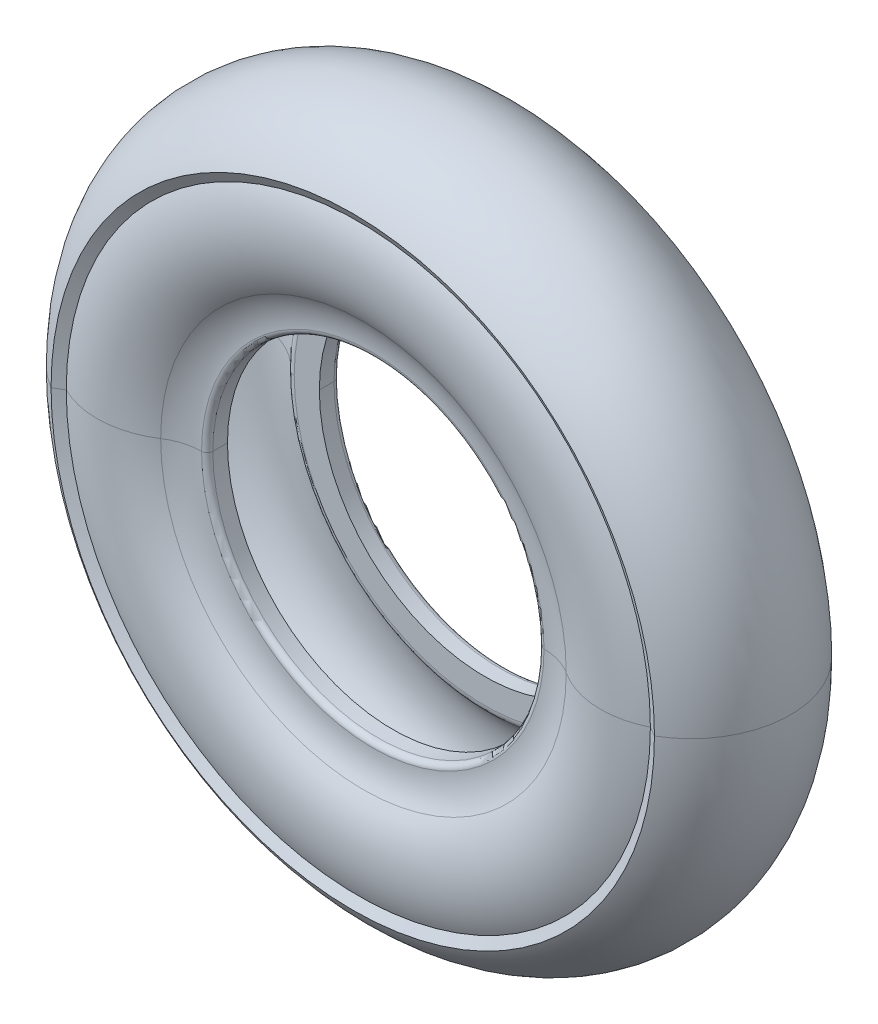
ISO-10303-21;
HEADER;
FILE_DESCRIPTION(('STEP AP214'),'2;1');
FILE_NAME('part.step','',(''),(''),'','','');
FILE_SCHEMA(('AUTOMOTIVE_DESIGN { 1 0 10303 214 1 1 1 1 }'));
ENDSEC;
DATA;
#1=APPLICATION_CONTEXT('core data for automotive mechanical design processes');
#2=APPLICATION_PROTOCOL_DEFINITION('international standard','automotive_design',2000,#1);
#3=PRODUCT_CONTEXT('',#1,'mechanical');
#4=PRODUCT('Part','Part','',(#3));
#5=PRODUCT_RELATED_PRODUCT_CATEGORY('part','',(#4));
#6=PRODUCT_DEFINITION_FORMATION('','',#4);
#7=PRODUCT_DEFINITION_CONTEXT('part definition',#1,'design');
#8=PRODUCT_DEFINITION('design','',#6,#7);
#9=PRODUCT_DEFINITION_SHAPE('','',#8);
#10=(LENGTH_UNIT() NAMED_UNIT(*) SI_UNIT(.MILLI.,.METRE.));
#11=(NAMED_UNIT(*) PLANE_ANGLE_UNIT() SI_UNIT($,.RADIAN.));
#12=(NAMED_UNIT(*) SI_UNIT($,.STERADIAN.) SOLID_ANGLE_UNIT());
#13=UNCERTAINTY_MEASURE_WITH_UNIT(LENGTH_MEASURE(1.E-05),#10,'distance_accuracy_value','');
#14=(GEOMETRIC_REPRESENTATION_CONTEXT(3) GLOBAL_UNCERTAINTY_ASSIGNED_CONTEXT((#13)) GLOBAL_UNIT_ASSIGNED_CONTEXT((#10,
#11,#12)) REPRESENTATION_CONTEXT('',''));
#15=CARTESIAN_POINT('',(0.,0.,0.));
#16=DIRECTION('',(0.,0.,1.));
#17=DIRECTION('',(1.,0.,0.));
#18=AXIS2_PLACEMENT_3D('',#15,#16,#17);
#19=CARTESIAN_POINT('',(0.,0.,24.3067350080178));
#20=DIRECTION('',(0.,0.,1.));
#21=DIRECTION('',(1.,0.,0.));
#22=AXIS2_PLACEMENT_3D('',#19,#20,#21);
#23=CONICAL_SURFACE('',#22,85.0265,1.04719755119661);
#24=DIRECTION('',(-0.866025403784445,0.,0.499999999999989));
#25=VECTOR('',#24,1.);
#26=CARTESIAN_POINT('',(-85.0265,0.,24.3067350080178));
#27=LINE('',#26,#25);
#28=CARTESIAN_POINT('',(-82.3110709239277,0.,22.7389812999823));
#29=VERTEX_POINT('',#28);
#30=CARTESIAN_POINT('',(-85.0265,0.,24.3067350080178));
#31=VERTEX_POINT('',#30);
#32=EDGE_CURVE('E172',#29,#31,#27,.T.);
#33=ORIENTED_EDGE('',*,*,#32,.F.);
#34=CARTESIAN_POINT('',(0.,0.,22.7389812999823));
#35=DIRECTION('',(0.,0.,-1.));
#36=DIRECTION('',(-1.,0.,0.));
#37=AXIS2_PLACEMENT_3D('',#34,#35,#36);
#38=CIRCLE('',#37,82.3110709239277);
#39=CARTESIAN_POINT('',(82.3110709239277,0.,22.7389812999823));
#40=VERTEX_POINT('',#39);
#41=EDGE_CURVE('E144',#29,#40,#38,.T.);
#42=ORIENTED_EDGE('',*,*,#41,.T.);
#43=DIRECTION('',(0.866025403784445,0.,0.499999999999989));
#44=VECTOR('',#43,1.);
#45=CARTESIAN_POINT('',(85.0265,0.,24.3067350080178));
#46=LINE('',#45,#44);
#47=CARTESIAN_POINT('',(85.0265,0.,24.3067350080178));
#48=VERTEX_POINT('',#47);
#49=EDGE_CURVE('E181',#40,#48,#46,.T.);
#50=ORIENTED_EDGE('',*,*,#49,.T.);
#51=CARTESIAN_POINT('',(0.,0.,24.3067350080178));
#52=DIRECTION('',(0.,0.,-1.));
#53=DIRECTION('',(-1.,0.,0.));
#54=AXIS2_PLACEMENT_3D('',#51,#52,#53);
#55=CIRCLE('',#54,85.0265);
#56=EDGE_CURVE('E174',#31,#48,#55,.T.);
#57=ORIENTED_EDGE('',*,*,#56,.F.);
#58=EDGE_LOOP('',(#33,#42,#50,#57));
#59=FACE_BOUND('',#58,.T.);
#60=ADVANCED_FACE('F17',(#59),#23,.F.);
#61=CARTESIAN_POINT('',(0.,0.,0.));
#62=DIRECTION('',(0.,0.,-1.));
#63=DIRECTION('',(-1.,0.,0.));
#64=AXIS2_PLACEMENT_3D('',#61,#62,#63);
#65=TOROIDAL_SURFACE('',#64,70.993,25.4);
#66=CARTESIAN_POINT('',(70.993,0.,0.));
#67=DIRECTION('',(0.,1.,0.));
#68=DIRECTION('',(-1.,0.,0.));
#69=AXIS2_PLACEMENT_3D('',#66,#67,#68);
#70=CIRCLE('',#69,25.4);
#71=CARTESIAN_POINT('',(57.15,0.,21.2962755194424));
#72=VERTEX_POINT('',#71);
#73=EDGE_CURVE('E166',#72,#40,#70,.T.);
#74=ORIENTED_EDGE('',*,*,#73,.F.);
#75=CARTESIAN_POINT('',(0.,0.,21.2962755194424));
#76=DIRECTION('',(0.,0.,-1.));
#77=DIRECTION('',(-1.,0.,0.));
#78=AXIS2_PLACEMENT_3D('',#75,#76,#77);
#79=CIRCLE('',#78,57.15);
#80=CARTESIAN_POINT('',(-57.15,0.,21.2962755194424));
#81=VERTEX_POINT('',#80);
#82=EDGE_CURVE('E159',#72,#81,#79,.T.);
#83=ORIENTED_EDGE('',*,*,#82,.T.);
#84=CARTESIAN_POINT('',(-70.993,0.,0.));
#85=DIRECTION('',(0.,-1.,0.));
#86=DIRECTION('',(0.,0.,-1.));
#87=AXIS2_PLACEMENT_3D('',#84,#85,#86);
#88=CIRCLE('',#87,25.4);
#89=EDGE_CURVE('E153',#81,#29,#88,.T.);
#90=ORIENTED_EDGE('',*,*,#89,.T.);
#91=CARTESIAN_POINT('',(0.,0.,22.7389812999823));
#92=DIRECTION('',(0.,0.,-1.));
#93=DIRECTION('',(-1.,0.,0.));
#94=AXIS2_PLACEMENT_3D('',#91,#92,#93);
#95=CIRCLE('',#94,82.3110709239277);
#96=EDGE_CURVE('E157',#40,#29,#95,.T.);
#97=ORIENTED_EDGE('',*,*,#96,.F.);
#98=EDGE_LOOP('',(#74,#83,#90,#97));
#99=FACE_BOUND('',#98,.T.);
#100=ADVANCED_FACE('F155',(#99),#65,.T.);
#101=CARTESIAN_POINT('',(0.,0.,34.9727827337632));
#102=DIRECTION('',(0.,0.,-1.));
#103=DIRECTION('',(-1.,0.,0.));
#104=AXIS2_PLACEMENT_3D('',#101,#102,#103);
#105=TOROIDAL_SURFACE('',#104,48.26,16.3119266055046);
#106=CARTESIAN_POINT('',(48.26,0.,34.9727827337632));
#107=DIRECTION('',(0.,1.,0.));
#108=DIRECTION('',(-1.,0.,0.));
#109=AXIS2_PLACEMENT_3D('',#106,#107,#108);
#110=CIRCLE('',#109,16.3119266055046);
#111=CARTESIAN_POINT('',(48.26,0.,18.6608561282586));
#112=VERTEX_POINT('',#111);
#113=EDGE_CURVE('E21',#72,#112,#110,.T.);
#114=ORIENTED_EDGE('',*,*,#113,.F.);
#115=CARTESIAN_POINT('',(0.,0.,21.2962755194424));
#116=DIRECTION('',(0.,0.,-1.));
#117=DIRECTION('',(-1.,0.,0.));
#118=AXIS2_PLACEMENT_3D('',#115,#116,#117);
#119=CIRCLE('',#118,57.15);
#120=EDGE_CURVE('E205',#81,#72,#119,.T.);
#121=ORIENTED_EDGE('',*,*,#120,.F.);
#122=CARTESIAN_POINT('',(-48.26,0.,34.9727827337632));
#123=DIRECTION('',(0.,-1.,0.));
#124=DIRECTION('',(0.,0.,-1.));
#125=AXIS2_PLACEMENT_3D('',#122,#123,#124);
#126=CIRCLE('',#125,16.3119266055046);
#127=CARTESIAN_POINT('',(-48.26,0.,18.6608561282586));
#128=VERTEX_POINT('',#127);
#129=EDGE_CURVE('E267',#81,#128,#126,.T.);
#130=ORIENTED_EDGE('',*,*,#129,.T.);
#131=CARTESIAN_POINT('',(0.,0.,18.6608561282586));
#132=DIRECTION('',(0.,0.,-1.));
#133=DIRECTION('',(-1.,0.,0.));
#134=AXIS2_PLACEMENT_3D('',#131,#132,#133);
#135=CIRCLE('',#134,48.26);
#136=EDGE_CURVE('E210',#128,#112,#135,.T.);
#137=ORIENTED_EDGE('',*,*,#136,.T.);
#138=EDGE_LOOP('',(#114,#121,#130,#137));
#139=FACE_BOUND('',#138,.T.);
#140=ADVANCED_FACE('F438',(#139),#105,.F.);
#141=CARTESIAN_POINT('',(0.,0.,17.0733561282586));
#142=DIRECTION('',(0.,0.,-1.));
#143=DIRECTION('',(-1.,0.,0.));
#144=AXIS2_PLACEMENT_3D('',#141,#142,#143);
#145=TOROIDAL_SURFACE('',#144,48.26,1.5875);
#146=CARTESIAN_POINT('',(48.26,0.,17.0733561282586));
#147=DIRECTION('',(0.,1.,0.));
#148=DIRECTION('',(-1.,0.,0.));
#149=AXIS2_PLACEMENT_3D('',#146,#147,#148);
#150=CIRCLE('',#149,1.5875);
#151=CARTESIAN_POINT('',(46.6725,0.,17.0733561282586));
#152=VERTEX_POINT('',#151);
#153=EDGE_CURVE('E266',#152,#112,#150,.T.);
#154=ORIENTED_EDGE('',*,*,#153,.F.);
#155=CARTESIAN_POINT('',(0.,0.,17.0733561282586));
#156=DIRECTION('',(0.,0.,-1.));
#157=DIRECTION('',(-1.,0.,0.));
#158=AXIS2_PLACEMENT_3D('',#155,#156,#157);
#159=CIRCLE('',#158,46.6725);
#160=CARTESIAN_POINT('',(-46.6725,0.,17.0733561282586));
#161=VERTEX_POINT('',#160);
#162=EDGE_CURVE('E209',#152,#161,#159,.T.);
#163=ORIENTED_EDGE('',*,*,#162,.T.);
#164=CARTESIAN_POINT('',(-48.26,0.,17.0733561282586));
#165=DIRECTION('',(0.,-1.,0.));
#166=DIRECTION('',(0.,0.,-1.));
#167=AXIS2_PLACEMENT_3D('',#164,#165,#166);
#168=CIRCLE('',#167,1.5875);
#169=EDGE_CURVE('E206',#161,#128,#168,.T.);
#170=ORIENTED_EDGE('',*,*,#169,.T.);
#171=CARTESIAN_POINT('',(0.,0.,18.6608561282586));
#172=DIRECTION('',(0.,0.,-1.));
#173=DIRECTION('',(-1.,0.,0.));
#174=AXIS2_PLACEMENT_3D('',#171,#172,#173);
#175=CIRCLE('',#174,48.26);
#176=EDGE_CURVE('E278',#112,#128,#175,.T.);
#177=ORIENTED_EDGE('',*,*,#176,.F.);
#178=EDGE_LOOP('',(#154,#163,#170,#177));
#179=FACE_BOUND('',#178,.T.);
#180=ADVANCED_FACE('F451',(#179),#145,.T.);
#181=CARTESIAN_POINT('',(0.,0.,0.));
#182=DIRECTION('',(0.,0.,-1.));
#183=DIRECTION('',(-1.,0.,0.));
#184=AXIS2_PLACEMENT_3D('',#181,#182,#183);
#185=CYLINDRICAL_SURFACE('',#184,46.6725);
#186=DIRECTION('',(0.,0.,-1.));
#187=VECTOR('',#186,1.);
#188=CARTESIAN_POINT('',(46.6725,0.,0.));
#189=LINE('',#188,#187);
#190=CARTESIAN_POINT('',(46.6725,0.,12.9458561282585));
#191=VERTEX_POINT('',#190);
#192=EDGE_CURVE('E189',#152,#191,#189,.T.);
#193=ORIENTED_EDGE('',*,*,#192,.F.);
#194=CARTESIAN_POINT('',(0.,0.,17.0733561282586));
#195=DIRECTION('',(0.,0.,-1.));
#196=DIRECTION('',(-1.,0.,0.));
#197=AXIS2_PLACEMENT_3D('',#194,#195,#196);
#198=CIRCLE('',#197,46.6725);
#199=EDGE_CURVE('E262',#161,#152,#198,.T.);
#200=ORIENTED_EDGE('',*,*,#199,.F.);
#201=DIRECTION('',(0.,0.,-1.));
#202=VECTOR('',#201,1.);
#203=CARTESIAN_POINT('',(-46.6725,0.,0.));
#204=LINE('',#203,#202);
#205=CARTESIAN_POINT('',(-46.6725,0.,12.9458561282585));
#206=VERTEX_POINT('',#205);
#207=EDGE_CURVE('E227',#161,#206,#204,.T.);
#208=ORIENTED_EDGE('',*,*,#207,.T.);
#209=CARTESIAN_POINT('',(0.,0.,12.9458561282585));
#210=DIRECTION('',(0.,0.,-1.));
#211=DIRECTION('',(-1.,0.,0.));
#212=AXIS2_PLACEMENT_3D('',#209,#210,#211);
#213=CIRCLE('',#212,46.6725);
#214=EDGE_CURVE('E11',#206,#191,#213,.T.);
#215=ORIENTED_EDGE('',*,*,#214,.T.);
#216=EDGE_LOOP('',(#193,#200,#208,#215));
#217=FACE_BOUND('',#216,.T.);
#218=ADVANCED_FACE('F454',(#217),#185,.F.);
#219=CARTESIAN_POINT('',(0.,53.7481524731334,12.9458561282585));
#220=DIRECTION('',(0.,0.,-1.));
#221=DIRECTION('',(0.,-1.,0.));
#222=AXIS2_PLACEMENT_3D('',#219,#220,#221);
#223=PLANE('',#222);
#224=ORIENTED_EDGE('',*,*,#214,.F.);
#225=CARTESIAN_POINT('',(0.,0.,12.9458561282585));
#226=DIRECTION('',(0.,0.,-1.));
#227=DIRECTION('',(-1.,0.,0.));
#228=AXIS2_PLACEMENT_3D('',#225,#226,#227);
#229=CIRCLE('',#228,46.6725);
#230=EDGE_CURVE('E223',#191,#206,#229,.T.);
#231=ORIENTED_EDGE('',*,*,#230,.F.);
#232=EDGE_LOOP('',(#224,#231));
#233=FACE_BOUND('',#232,.T.);
#234=CARTESIAN_POINT('',(0.,0.,12.9458561282585));
#235=DIRECTION('',(0.,0.,-1.));
#236=DIRECTION('',(-1.,0.,0.));
#237=AXIS2_PLACEMENT_3D('',#234,#235,#236);
#238=CIRCLE('',#237,53.7481524731334);
#239=CARTESIAN_POINT('',(-53.7481524731334,0.,12.9458561282585));
#240=VERTEX_POINT('',#239);
#241=CARTESIAN_POINT('',(53.7481524731334,0.,12.9458561282585));
#242=VERTEX_POINT('',#241);
#243=EDGE_CURVE('E317',#240,#242,#238,.T.);
#244=ORIENTED_EDGE('',*,*,#243,.T.);
#245=CARTESIAN_POINT('',(0.,0.,12.9458561282585));
#246=DIRECTION('',(0.,0.,-1.));
#247=DIRECTION('',(-1.,0.,0.));
#248=AXIS2_PLACEMENT_3D('',#245,#246,#247);
#249=CIRCLE('',#248,53.7481524731334);
#250=EDGE_CURVE('E28',#242,#240,#249,.T.);
#251=ORIENTED_EDGE('',*,*,#250,.T.);
#252=EDGE_LOOP('',(#244,#251));
#253=FACE_BOUND('',#252,.T.);
#254=ADVANCED_FACE('F459',(#233,#253),#223,.T.);
#255=CARTESIAN_POINT('',(0.,0.,15.4858561282586));
#256=DIRECTION('',(0.,0.,-1.));
#257=DIRECTION('',(-1.,0.,0.));
#258=AXIS2_PLACEMENT_3D('',#255,#256,#257);
#259=TOROIDAL_SURFACE('',#258,53.7481524731334,2.54);
#260=CARTESIAN_POINT('',(53.7481524731334,0.,15.4858561282586));
#261=DIRECTION('',(0.,1.,0.));
#262=DIRECTION('',(-1.,0.,0.));
#263=AXIS2_PLACEMENT_3D('',#260,#261,#262);
#264=CIRCLE('',#263,2.54);
#265=CARTESIAN_POINT('',(55.6379987774475,0.,13.7887760046138));
#266=VERTEX_POINT('',#265);
#267=EDGE_CURVE('E321',#266,#242,#264,.T.);
#268=ORIENTED_EDGE('',*,*,#267,.F.);
#269=CARTESIAN_POINT('',(0.,0.,13.7887760046138));
#270=DIRECTION('',(0.,0.,-1.));
#271=DIRECTION('',(-1.,0.,0.));
#272=AXIS2_PLACEMENT_3D('',#269,#270,#271);
#273=CIRCLE('',#272,55.6379987774475);
#274=CARTESIAN_POINT('',(-55.6379987774475,0.,13.7887760046138));
#275=VERTEX_POINT('',#274);
#276=EDGE_CURVE('E261',#266,#275,#273,.T.);
#277=ORIENTED_EDGE('',*,*,#276,.T.);
#278=CARTESIAN_POINT('',(-53.7481524731334,0.,15.4858561282586));
#279=DIRECTION('',(0.,-1.,0.));
#280=DIRECTION('',(0.,0.,-1.));
#281=AXIS2_PLACEMENT_3D('',#278,#279,#280);
#282=CIRCLE('',#281,2.54);
#283=EDGE_CURVE('E314',#275,#240,#282,.T.);
#284=ORIENTED_EDGE('',*,*,#283,.T.);
#285=ORIENTED_EDGE('',*,*,#250,.F.);
#286=EDGE_LOOP('',(#268,#277,#284,#285));
#287=FACE_BOUND('',#286,.T.);
#288=ADVANCED_FACE('F456',(#287),#259,.T.);
#289=CARTESIAN_POINT('',(0.,0.,0.));
#290=DIRECTION('',(0.,0.,-1.));
#291=DIRECTION('',(-1.,0.,0.));
#292=AXIS2_PLACEMENT_3D('',#289,#290,#291);
#293=TOROIDAL_SURFACE('',#292,70.993,20.6375);
#294=CARTESIAN_POINT('',(70.993,0.,0.));
#295=DIRECTION('',(0.,1.,0.));
#296=DIRECTION('',(-1.,0.,0.));
#297=AXIS2_PLACEMENT_3D('',#294,#295,#296);
#298=CIRCLE('',#297,20.6375);
#299=CARTESIAN_POINT('',(55.6379987774475,0.,-13.7887760046138));
#300=VERTEX_POINT('',#299);
#301=EDGE_CURVE('E256',#266,#300,#298,.T.);
#302=ORIENTED_EDGE('',*,*,#301,.F.);
#303=CARTESIAN_POINT('',(0.,0.,13.7887760046138));
#304=DIRECTION('',(0.,0.,-1.));
#305=DIRECTION('',(-1.,0.,0.));
#306=AXIS2_PLACEMENT_3D('',#303,#304,#305);
#307=CIRCLE('',#306,55.6379987774475);
#308=EDGE_CURVE('E277',#275,#266,#307,.T.);
#309=ORIENTED_EDGE('',*,*,#308,.F.);
#310=CARTESIAN_POINT('',(-70.993,0.,0.));
#311=DIRECTION('',(0.,-1.,0.));
#312=DIRECTION('',(0.,0.,-1.));
#313=AXIS2_PLACEMENT_3D('',#310,#311,#312);
#314=CIRCLE('',#313,20.6375);
#315=CARTESIAN_POINT('',(-55.6379987774475,0.,-13.7887760046138));
#316=VERTEX_POINT('',#315);
#317=EDGE_CURVE('E284',#275,#316,#314,.T.);
#318=ORIENTED_EDGE('',*,*,#317,.T.);
#319=CARTESIAN_POINT('',(0.,0.,-13.7887760046138));
#320=DIRECTION('',(0.,0.,-1.));
#321=DIRECTION('',(-1.,0.,0.));
#322=AXIS2_PLACEMENT_3D('',#319,#320,#321);
#323=CIRCLE('',#322,55.6379987774475);
#324=EDGE_CURVE('E215',#316,#300,#323,.T.);
#325=ORIENTED_EDGE('',*,*,#324,.T.);
#326=EDGE_LOOP('',(#302,#309,#318,#325));
#327=FACE_BOUND('',#326,.T.);
#328=ADVANCED_FACE('F429',(#327),#293,.F.);
#329=CARTESIAN_POINT('',(0.,0.,-15.4858561282586));
#330=DIRECTION('',(0.,0.,-1.));
#331=DIRECTION('',(-1.,0.,0.));
#332=AXIS2_PLACEMENT_3D('',#329,#330,#331);
#333=TOROIDAL_SURFACE('',#332,53.7481524731334,2.54);
#334=CARTESIAN_POINT('',(53.7481524731334,0.,-15.4858561282586));
#335=DIRECTION('',(0.,1.,0.));
#336=DIRECTION('',(-1.,0.,0.));
#337=AXIS2_PLACEMENT_3D('',#334,#335,#336);
#338=CIRCLE('',#337,2.54);
#339=CARTESIAN_POINT('',(53.7481524731334,0.,-12.9458561282585));
#340=VERTEX_POINT('',#339);
#341=EDGE_CURVE('E211',#340,#300,#338,.T.);
#342=ORIENTED_EDGE('',*,*,#341,.F.);
#343=CARTESIAN_POINT('',(0.,0.,-12.9458561282585));
#344=DIRECTION('',(0.,0.,-1.));
#345=DIRECTION('',(-1.,0.,0.));
#346=AXIS2_PLACEMENT_3D('',#343,#344,#345);
#347=CIRCLE('',#346,53.7481524731334);
#348=CARTESIAN_POINT('',(-53.7481524731334,0.,-12.9458561282585));
#349=VERTEX_POINT('',#348);
#350=EDGE_CURVE('E238',#340,#349,#347,.T.);
#351=ORIENTED_EDGE('',*,*,#350,.T.);
#352=CARTESIAN_POINT('',(-53.7481524731334,0.,-15.4858561282586));
#353=DIRECTION('',(0.,-1.,0.));
#354=DIRECTION('',(0.,0.,-1.));
#355=AXIS2_PLACEMENT_3D('',#352,#353,#354);
#356=CIRCLE('',#355,2.54);
#357=EDGE_CURVE('E301',#349,#316,#356,.T.);
#358=ORIENTED_EDGE('',*,*,#357,.T.);
#359=CARTESIAN_POINT('',(0.,0.,-13.7887760046138));
#360=DIRECTION('',(0.,0.,-1.));
#361=DIRECTION('',(-1.,0.,0.));
#362=AXIS2_PLACEMENT_3D('',#359,#360,#361);
#363=CIRCLE('',#362,55.6379987774475);
#364=EDGE_CURVE('E260',#300,#316,#363,.T.);
#365=ORIENTED_EDGE('',*,*,#364,.F.);
#366=EDGE_LOOP('',(#342,#351,#358,#365));
#367=FACE_BOUND('',#366,.T.);
#368=ADVANCED_FACE('F409',(#367),#333,.T.);
#369=CARTESIAN_POINT('',(0.,46.6725,-12.9458561282585));
#370=DIRECTION('',(0.,0.,1.));
#371=DIRECTION('',(1.,0.,0.));
#372=AXIS2_PLACEMENT_3D('',#369,#370,#371);
#373=PLANE('',#372);
#374=CARTESIAN_POINT('',(0.,0.,-12.9458561282585));
#375=DIRECTION('',(0.,0.,-1.));
#376=DIRECTION('',(-1.,0.,0.));
#377=AXIS2_PLACEMENT_3D('',#374,#375,#376);
#378=CIRCLE('',#377,46.6725);
#379=CARTESIAN_POINT('',(-46.6725,0.,-12.9458561282585));
#380=VERTEX_POINT('',#379);
#381=CARTESIAN_POINT('',(46.6725,0.,-12.9458561282585));
#382=VERTEX_POINT('',#381);
#383=EDGE_CURVE('E201',#380,#382,#378,.T.);
#384=ORIENTED_EDGE('',*,*,#383,.T.);
#385=CARTESIAN_POINT('',(0.,0.,-12.9458561282585));
#386=DIRECTION('',(0.,0.,-1.));
#387=DIRECTION('',(-1.,0.,0.));
#388=AXIS2_PLACEMENT_3D('',#385,#386,#387);
#389=CIRCLE('',#388,46.6725);
#390=EDGE_CURVE('E304',#382,#380,#389,.T.);
#391=ORIENTED_EDGE('',*,*,#390,.T.);
#392=EDGE_LOOP('',(#384,#391));
#393=FACE_BOUND('',#392,.T.);
#394=CARTESIAN_POINT('',(0.,0.,-12.9458561282585));
#395=DIRECTION('',(0.,0.,-1.));
#396=DIRECTION('',(-1.,0.,0.));
#397=AXIS2_PLACEMENT_3D('',#394,#395,#396);
#398=CIRCLE('',#397,53.7481524731334);
#399=EDGE_CURVE('E216',#349,#340,#398,.T.);
#400=ORIENTED_EDGE('',*,*,#399,.F.);
#401=ORIENTED_EDGE('',*,*,#350,.F.);
#402=EDGE_LOOP('',(#400,#401));
#403=FACE_BOUND('',#402,.T.);
#404=ADVANCED_FACE('F416',(#393,#403),#373,.T.);
#405=CARTESIAN_POINT('',(0.,0.,0.));
#406=DIRECTION('',(0.,0.,-1.));
#407=DIRECTION('',(-1.,0.,0.));
#408=AXIS2_PLACEMENT_3D('',#405,#406,#407);
#409=CYLINDRICAL_SURFACE('',#408,46.6725);
#410=DIRECTION('',(0.,0.,-1.));
#411=VECTOR('',#410,1.);
#412=CARTESIAN_POINT('',(46.6725,0.,0.));
#413=LINE('',#412,#411);
#414=CARTESIAN_POINT('',(46.6725,0.,-17.0733561282586));
#415=VERTEX_POINT('',#414);
#416=EDGE_CURVE('E308',#382,#415,#413,.T.);
#417=ORIENTED_EDGE('',*,*,#416,.F.);
#418=ORIENTED_EDGE('',*,*,#383,.F.);
#419=DIRECTION('',(0.,0.,-1.));
#420=VECTOR('',#419,1.);
#421=CARTESIAN_POINT('',(-46.6725,0.,0.));
#422=LINE('',#421,#420);
#423=CARTESIAN_POINT('',(-46.6725,0.,-17.0733561282586));
#424=VERTEX_POINT('',#423);
#425=EDGE_CURVE('E268',#380,#424,#422,.T.);
#426=ORIENTED_EDGE('',*,*,#425,.T.);
#427=CARTESIAN_POINT('',(0.,0.,-17.0733561282586));
#428=DIRECTION('',(0.,0.,-1.));
#429=DIRECTION('',(-1.,0.,0.));
#430=AXIS2_PLACEMENT_3D('',#427,#428,#429);
#431=CIRCLE('',#430,46.6725);
#432=EDGE_CURVE('E242',#424,#415,#431,.T.);
#433=ORIENTED_EDGE('',*,*,#432,.T.);
#434=EDGE_LOOP('',(#417,#418,#426,#433));
#435=FACE_BOUND('',#434,.T.);
#436=ADVANCED_FACE('F418',(#435),#409,.F.);
#437=CARTESIAN_POINT('',(0.,0.,-17.0733561282586));
#438=DIRECTION('',(0.,0.,-1.));
#439=DIRECTION('',(-1.,0.,0.));
#440=AXIS2_PLACEMENT_3D('',#437,#438,#439);
#441=TOROIDAL_SURFACE('',#440,48.26,1.5875);
#442=CARTESIAN_POINT('',(48.26,0.,-17.0733561282586));
#443=DIRECTION('',(0.,1.,0.));
#444=DIRECTION('',(-1.,0.,0.));
#445=AXIS2_PLACEMENT_3D('',#442,#443,#444);
#446=CIRCLE('',#445,1.5875);
#447=CARTESIAN_POINT('',(48.26,0.,-18.6608561282586));
#448=VERTEX_POINT('',#447);
#449=EDGE_CURVE('E246',#448,#415,#446,.T.);
#450=ORIENTED_EDGE('',*,*,#449,.F.);
#451=CARTESIAN_POINT('',(0.,0.,-18.6608561282586));
#452=DIRECTION('',(0.,0.,-1.));
#453=DIRECTION('',(-1.,0.,0.));
#454=AXIS2_PLACEMENT_3D('',#451,#452,#453);
#455=CIRCLE('',#454,48.26);
#456=CARTESIAN_POINT('',(-48.26,0.,-18.6608561282586));
#457=VERTEX_POINT('',#456);
#458=EDGE_CURVE('E217',#448,#457,#455,.T.);
#459=ORIENTED_EDGE('',*,*,#458,.T.);
#460=CARTESIAN_POINT('',(-48.26,0.,-17.0733561282586));
#461=DIRECTION('',(0.,-1.,0.));
#462=DIRECTION('',(0.,0.,-1.));
#463=AXIS2_PLACEMENT_3D('',#460,#461,#462);
#464=CIRCLE('',#463,1.5875);
#465=EDGE_CURVE('E222',#457,#424,#464,.T.);
#466=ORIENTED_EDGE('',*,*,#465,.T.);
#467=CARTESIAN_POINT('',(0.,0.,-17.0733561282586));
#468=DIRECTION('',(0.,0.,-1.));
#469=DIRECTION('',(-1.,0.,0.));
#470=AXIS2_PLACEMENT_3D('',#467,#468,#469);
#471=CIRCLE('',#470,46.6725);
#472=EDGE_CURVE('E273',#415,#424,#471,.T.);
#473=ORIENTED_EDGE('',*,*,#472,.F.);
#474=EDGE_LOOP('',(#450,#459,#466,#473));
#475=FACE_BOUND('',#474,.T.);
#476=ADVANCED_FACE('F426',(#475),#441,.T.);
#477=CARTESIAN_POINT('',(0.,0.,-34.9727827337632));
#478=DIRECTION('',(0.,0.,-1.));
#479=DIRECTION('',(-1.,0.,0.));
#480=AXIS2_PLACEMENT_3D('',#477,#478,#479);
#481=TOROIDAL_SURFACE('',#480,48.26,16.3119266055046);
#482=CARTESIAN_POINT('',(48.26,0.,-34.9727827337632));
#483=DIRECTION('',(0.,1.,0.));
#484=DIRECTION('',(-1.,0.,0.));
#485=AXIS2_PLACEMENT_3D('',#482,#483,#484);
#486=CIRCLE('',#485,16.3119266055046);
#487=CARTESIAN_POINT('',(57.15,0.,-21.2962755194424));
#488=VERTEX_POINT('',#487);
#489=EDGE_CURVE('E221',#448,#488,#486,.T.);
#490=ORIENTED_EDGE('',*,*,#489,.F.);
#491=CARTESIAN_POINT('',(0.,0.,-18.6608561282586));
#492=DIRECTION('',(0.,0.,-1.));
#493=DIRECTION('',(-1.,0.,0.));
#494=AXIS2_PLACEMENT_3D('',#491,#492,#493);
#495=CIRCLE('',#494,48.26);
#496=EDGE_CURVE('E272',#457,#448,#495,.T.);
#497=ORIENTED_EDGE('',*,*,#496,.F.);
#498=CARTESIAN_POINT('',(-48.26,0.,-34.9727827337632));
#499=DIRECTION('',(0.,-1.,0.));
#500=DIRECTION('',(0.,0.,-1.));
#501=AXIS2_PLACEMENT_3D('',#498,#499,#500);
#502=CIRCLE('',#501,16.3119266055046);
#503=CARTESIAN_POINT('',(-57.15,0.,-21.2962755194424));
#504=VERTEX_POINT('',#503);
#505=EDGE_CURVE('E251',#457,#504,#502,.T.);
#506=ORIENTED_EDGE('',*,*,#505,.T.);
#507=CARTESIAN_POINT('',(0.,0.,-21.2962755194424));
#508=DIRECTION('',(0.,0.,-1.));
#509=DIRECTION('',(-1.,0.,0.));
#510=AXIS2_PLACEMENT_3D('',#507,#508,#509);
#511=CIRCLE('',#510,57.15);
#512=EDGE_CURVE('E193',#504,#488,#511,.T.);
#513=ORIENTED_EDGE('',*,*,#512,.T.);
#514=EDGE_LOOP('',(#490,#497,#506,#513));
#515=FACE_BOUND('',#514,.T.);
#516=ADVANCED_FACE('F386',(#515),#481,.F.);
#517=CARTESIAN_POINT('',(0.,0.,0.));
#518=DIRECTION('',(0.,0.,-1.));
#519=DIRECTION('',(-1.,0.,0.));
#520=AXIS2_PLACEMENT_3D('',#517,#518,#519);
#521=TOROIDAL_SURFACE('',#520,70.993,25.4);
#522=CARTESIAN_POINT('',(70.993,0.,0.));
#523=DIRECTION('',(0.,1.,0.));
#524=DIRECTION('',(-1.,0.,0.));
#525=AXIS2_PLACEMENT_3D('',#522,#523,#524);
#526=CIRCLE('',#525,25.4);
#527=CARTESIAN_POINT('',(82.3110709239277,0.,-22.7389812999823));
#528=VERTEX_POINT('',#527);
#529=EDGE_CURVE('E198',#528,#488,#526,.T.);
#530=ORIENTED_EDGE('',*,*,#529,.F.);
#531=CARTESIAN_POINT('',(0.,0.,-22.7389812999823));
#532=DIRECTION('',(0.,0.,-1.));
#533=DIRECTION('',(-1.,0.,0.));
#534=AXIS2_PLACEMENT_3D('',#531,#532,#533);
#535=CIRCLE('',#534,82.3110709239277);
#536=CARTESIAN_POINT('',(-82.3110709239277,0.,-22.7389812999823));
#537=VERTEX_POINT('',#536);
#538=EDGE_CURVE('E228',#528,#537,#535,.T.);
#539=ORIENTED_EDGE('',*,*,#538,.T.);
#540=CARTESIAN_POINT('',(-70.993,0.,0.));
#541=DIRECTION('',(0.,-1.,0.));
#542=DIRECTION('',(0.,0.,-1.));
#543=AXIS2_PLACEMENT_3D('',#540,#541,#542);
#544=CIRCLE('',#543,25.4);
#545=EDGE_CURVE('E197',#537,#504,#544,.T.);
#546=ORIENTED_EDGE('',*,*,#545,.T.);
#547=CARTESIAN_POINT('',(0.,0.,-21.2962755194424));
#548=DIRECTION('',(0.,0.,-1.));
#549=DIRECTION('',(-1.,0.,0.));
#550=AXIS2_PLACEMENT_3D('',#547,#548,#549);
#551=CIRCLE('',#550,57.15);
#552=EDGE_CURVE('E297',#488,#504,#551,.T.);
#553=ORIENTED_EDGE('',*,*,#552,.F.);
#554=EDGE_LOOP('',(#530,#539,#546,#553));
#555=FACE_BOUND('',#554,.T.);
#556=ADVANCED_FACE('F374',(#555),#521,.T.);
#557=CARTESIAN_POINT('',(0.,0.,-22.7389812999823));
#558=DIRECTION('',(0.,0.,-1.));
#559=DIRECTION('',(-1.,0.,0.));
#560=AXIS2_PLACEMENT_3D('',#557,#558,#559);
#561=CONICAL_SURFACE('',#560,82.3110709239277,1.04719755119661);
#562=DIRECTION('',(0.866025403784444,0.,-0.499999999999991));
#563=VECTOR('',#562,1.);
#564=CARTESIAN_POINT('',(82.3110709239277,0.,-22.7389812999823));
#565=LINE('',#564,#563);
#566=CARTESIAN_POINT('',(85.0265,0.,-24.3067350080178));
#567=VERTEX_POINT('',#566);
#568=EDGE_CURVE('E232',#528,#567,#565,.T.);
#569=ORIENTED_EDGE('',*,*,#568,.F.);
#570=CARTESIAN_POINT('',(0.,0.,-22.7389812999823));
#571=DIRECTION('',(0.,0.,-1.));
#572=DIRECTION('',(-1.,0.,0.));
#573=AXIS2_PLACEMENT_3D('',#570,#571,#572);
#574=CIRCLE('',#573,82.3110709239277);
#575=EDGE_CURVE('E247',#537,#528,#574,.T.);
#576=ORIENTED_EDGE('',*,*,#575,.F.);
#577=DIRECTION('',(-0.866025403784444,0.,-0.499999999999991));
#578=VECTOR('',#577,1.);
#579=CARTESIAN_POINT('',(-82.3110709239277,0.,-22.7389812999823));
#580=LINE('',#579,#578);
#581=CARTESIAN_POINT('',(-85.0265,0.,-24.3067350080178));
#582=VERTEX_POINT('',#581);
#583=EDGE_CURVE('E233',#537,#582,#580,.T.);
#584=ORIENTED_EDGE('',*,*,#583,.T.);
#585=CARTESIAN_POINT('',(0.,0.,-24.3067350080178));
#586=DIRECTION('',(0.,0.,-1.));
#587=DIRECTION('',(-1.,0.,0.));
#588=AXIS2_PLACEMENT_3D('',#585,#586,#587);
#589=CIRCLE('',#588,85.0265);
#590=EDGE_CURVE('E202',#582,#567,#589,.T.);
#591=ORIENTED_EDGE('',*,*,#590,.T.);
#592=EDGE_LOOP('',(#569,#576,#584,#591));
#593=FACE_BOUND('',#592,.T.);
#594=ADVANCED_FACE('F371',(#593),#561,.F.);
#595=CARTESIAN_POINT('',(0.,0.,0.));
#596=DIRECTION('',(0.,0.,-1.));
#597=DIRECTION('',(-1.,0.,0.));
#598=AXIS2_PLACEMENT_3D('',#595,#596,#597);
#599=TOROIDAL_SURFACE('',#598,70.993,28.067);
#600=CARTESIAN_POINT('',(70.993,0.,0.));
#601=DIRECTION('',(0.,1.,0.));
#602=DIRECTION('',(-1.,0.,0.));
#603=AXIS2_PLACEMENT_3D('',#600,#601,#602);
#604=CIRCLE('',#603,28.067);
#605=EDGE_CURVE('E252',#48,#567,#604,.T.);
#606=ORIENTED_EDGE('',*,*,#605,.F.);
#607=CARTESIAN_POINT('',(0.,0.,24.3067350080178));
#608=DIRECTION('',(0.,0.,-1.));
#609=DIRECTION('',(-1.,0.,0.));
#610=AXIS2_PLACEMENT_3D('',#607,#608,#609);
#611=CIRCLE('',#610,85.0265);
#612=EDGE_CURVE('E178',#48,#31,#611,.T.);
#613=ORIENTED_EDGE('',*,*,#612,.T.);
#614=CARTESIAN_POINT('',(-70.993,0.,0.));
#615=DIRECTION('',(0.,-1.,0.));
#616=DIRECTION('',(0.,0.,-1.));
#617=AXIS2_PLACEMENT_3D('',#614,#615,#616);
#618=CIRCLE('',#617,28.067);
#619=EDGE_CURVE('E43',#31,#582,#618,.T.);
#620=ORIENTED_EDGE('',*,*,#619,.T.);
#621=CARTESIAN_POINT('',(0.,0.,-24.3067350080178));
#622=DIRECTION('',(0.,0.,-1.));
#623=DIRECTION('',(-1.,0.,0.));
#624=AXIS2_PLACEMENT_3D('',#621,#622,#623);
#625=CIRCLE('',#624,85.0265);
#626=EDGE_CURVE('E237',#567,#582,#625,.T.);
#627=ORIENTED_EDGE('',*,*,#626,.F.);
#628=EDGE_LOOP('',(#606,#613,#620,#627));
#629=FACE_BOUND('',#628,.T.);
#630=ADVANCED_FACE('F19',(#629),#599,.T.);
#631=CARTESIAN_POINT('',(0.,0.,0.));
#632=DIRECTION('',(0.,0.,-1.));
#633=DIRECTION('',(-1.,0.,0.));
#634=AXIS2_PLACEMENT_3D('',#631,#632,#633);
#635=TOROIDAL_SURFACE('',#634,70.993,28.067);
#636=ORIENTED_EDGE('',*,*,#56,.T.);
#637=ORIENTED_EDGE('',*,*,#605,.T.);
#638=ORIENTED_EDGE('',*,*,#590,.F.);
#639=ORIENTED_EDGE('',*,*,#619,.F.);
#640=EDGE_LOOP('',(#636,#637,#638,#639));
#641=FACE_BOUND('',#640,.T.);
#642=ADVANCED_FACE('F360',(#641),#635,.T.);
#643=CARTESIAN_POINT('',(0.,0.,-22.7389812999823));
#644=DIRECTION('',(0.,0.,-1.));
#645=DIRECTION('',(-1.,0.,0.));
#646=AXIS2_PLACEMENT_3D('',#643,#644,#645);
#647=CONICAL_SURFACE('',#646,82.3110709239277,1.04719755119661);
#648=ORIENTED_EDGE('',*,*,#538,.F.);
#649=ORIENTED_EDGE('',*,*,#568,.T.);
#650=ORIENTED_EDGE('',*,*,#626,.T.);
#651=ORIENTED_EDGE('',*,*,#583,.F.);
#652=EDGE_LOOP('',(#648,#649,#650,#651));
#653=FACE_BOUND('',#652,.T.);
#654=ADVANCED_FACE('F367',(#653),#647,.F.);
#655=CARTESIAN_POINT('',(0.,0.,0.));
#656=DIRECTION('',(0.,0.,-1.));
#657=DIRECTION('',(-1.,0.,0.));
#658=AXIS2_PLACEMENT_3D('',#655,#656,#657);
#659=TOROIDAL_SURFACE('',#658,70.993,25.4);
#660=ORIENTED_EDGE('',*,*,#575,.T.);
#661=ORIENTED_EDGE('',*,*,#529,.T.);
#662=ORIENTED_EDGE('',*,*,#512,.F.);
#663=ORIENTED_EDGE('',*,*,#545,.F.);
#664=EDGE_LOOP('',(#660,#661,#662,#663));
#665=FACE_BOUND('',#664,.T.);
#666=ADVANCED_FACE('F379',(#665),#659,.T.);
#667=CARTESIAN_POINT('',(0.,0.,-34.9727827337632));
#668=DIRECTION('',(0.,0.,-1.));
#669=DIRECTION('',(-1.,0.,0.));
#670=AXIS2_PLACEMENT_3D('',#667,#668,#669);
#671=TOROIDAL_SURFACE('',#670,48.26,16.3119266055046);
#672=ORIENTED_EDGE('',*,*,#458,.F.);
#673=ORIENTED_EDGE('',*,*,#489,.T.);
#674=ORIENTED_EDGE('',*,*,#552,.T.);
#675=ORIENTED_EDGE('',*,*,#505,.F.);
#676=EDGE_LOOP('',(#672,#673,#674,#675));
#677=FACE_BOUND('',#676,.T.);
#678=ADVANCED_FACE('F390',(#677),#671,.F.);
#679=CARTESIAN_POINT('',(0.,0.,-17.0733561282586));
#680=DIRECTION('',(0.,0.,-1.));
#681=DIRECTION('',(-1.,0.,0.));
#682=AXIS2_PLACEMENT_3D('',#679,#680,#681);
#683=TOROIDAL_SURFACE('',#682,48.26,1.5875);
#684=ORIENTED_EDGE('',*,*,#496,.T.);
#685=ORIENTED_EDGE('',*,*,#449,.T.);
#686=ORIENTED_EDGE('',*,*,#432,.F.);
#687=ORIENTED_EDGE('',*,*,#465,.F.);
#688=EDGE_LOOP('',(#684,#685,#686,#687));
#689=FACE_BOUND('',#688,.T.);
#690=ADVANCED_FACE('F444',(#689),#683,.T.);
#691=CARTESIAN_POINT('',(0.,0.,0.));
#692=DIRECTION('',(0.,0.,-1.));
#693=DIRECTION('',(-1.,0.,0.));
#694=AXIS2_PLACEMENT_3D('',#691,#692,#693);
#695=CYLINDRICAL_SURFACE('',#694,46.6725);
#696=ORIENTED_EDGE('',*,*,#390,.F.);
#697=ORIENTED_EDGE('',*,*,#416,.T.);
#698=ORIENTED_EDGE('',*,*,#472,.T.);
#699=ORIENTED_EDGE('',*,*,#425,.F.);
#700=EDGE_LOOP('',(#696,#697,#698,#699));
#701=FACE_BOUND('',#700,.T.);
#702=ADVANCED_FACE('F465',(#701),#695,.F.);
#703=CARTESIAN_POINT('',(0.,0.,-15.4858561282586));
#704=DIRECTION('',(0.,0.,-1.));
#705=DIRECTION('',(-1.,0.,0.));
#706=AXIS2_PLACEMENT_3D('',#703,#704,#705);
#707=TOROIDAL_SURFACE('',#706,53.7481524731334,2.54);
#708=ORIENTED_EDGE('',*,*,#399,.T.);
#709=ORIENTED_EDGE('',*,*,#341,.T.);
#710=ORIENTED_EDGE('',*,*,#324,.F.);
#711=ORIENTED_EDGE('',*,*,#357,.F.);
#712=EDGE_LOOP('',(#708,#709,#710,#711));
#713=FACE_BOUND('',#712,.T.);
#714=ADVANCED_FACE('F415',(#713),#707,.T.);
#715=CARTESIAN_POINT('',(0.,0.,0.));
#716=DIRECTION('',(0.,0.,-1.));
#717=DIRECTION('',(-1.,0.,0.));
#718=AXIS2_PLACEMENT_3D('',#715,#716,#717);
#719=TOROIDAL_SURFACE('',#718,70.993,20.6375);
#720=ORIENTED_EDGE('',*,*,#276,.F.);
#721=ORIENTED_EDGE('',*,*,#301,.T.);
#722=ORIENTED_EDGE('',*,*,#364,.T.);
#723=ORIENTED_EDGE('',*,*,#317,.F.);
#724=EDGE_LOOP('',(#720,#721,#722,#723));
#725=FACE_BOUND('',#724,.T.);
#726=ADVANCED_FACE('F446',(#725),#719,.F.);
#727=CARTESIAN_POINT('',(0.,0.,15.4858561282586));
#728=DIRECTION('',(0.,0.,-1.));
#729=DIRECTION('',(-1.,0.,0.));
#730=AXIS2_PLACEMENT_3D('',#727,#728,#729);
#731=TOROIDAL_SURFACE('',#730,53.7481524731334,2.54);
#732=ORIENTED_EDGE('',*,*,#308,.T.);
#733=ORIENTED_EDGE('',*,*,#267,.T.);
#734=ORIENTED_EDGE('',*,*,#243,.F.);
#735=ORIENTED_EDGE('',*,*,#283,.F.);
#736=EDGE_LOOP('',(#732,#733,#734,#735));
#737=FACE_BOUND('',#736,.T.);
#738=ADVANCED_FACE('F449',(#737),#731,.T.);
#739=CARTESIAN_POINT('',(0.,0.,0.));
#740=DIRECTION('',(0.,0.,-1.));
#741=DIRECTION('',(-1.,0.,0.));
#742=AXIS2_PLACEMENT_3D('',#739,#740,#741);
#743=CYLINDRICAL_SURFACE('',#742,46.6725);
#744=ORIENTED_EDGE('',*,*,#162,.F.);
#745=ORIENTED_EDGE('',*,*,#192,.T.);
#746=ORIENTED_EDGE('',*,*,#230,.T.);
#747=ORIENTED_EDGE('',*,*,#207,.F.);
#748=EDGE_LOOP('',(#744,#745,#746,#747));
#749=FACE_BOUND('',#748,.T.);
#750=ADVANCED_FACE('F460',(#749),#743,.F.);
#751=CARTESIAN_POINT('',(0.,0.,17.0733561282586));
#752=DIRECTION('',(0.,0.,-1.));
#753=DIRECTION('',(-1.,0.,0.));
#754=AXIS2_PLACEMENT_3D('',#751,#752,#753);
#755=TOROIDAL_SURFACE('',#754,48.26,1.5875);
#756=ORIENTED_EDGE('',*,*,#199,.T.);
#757=ORIENTED_EDGE('',*,*,#153,.T.);
#758=ORIENTED_EDGE('',*,*,#136,.F.);
#759=ORIENTED_EDGE('',*,*,#169,.F.);
#760=EDGE_LOOP('',(#756,#757,#758,#759));
#761=FACE_BOUND('',#760,.T.);
#762=ADVANCED_FACE('F462',(#761),#755,.T.);
#763=CARTESIAN_POINT('',(0.,0.,34.9727827337632));
#764=DIRECTION('',(0.,0.,-1.));
#765=DIRECTION('',(-1.,0.,0.));
#766=AXIS2_PLACEMENT_3D('',#763,#764,#765);
#767=TOROIDAL_SURFACE('',#766,48.26,16.3119266055046);
#768=ORIENTED_EDGE('',*,*,#82,.F.);
#769=ORIENTED_EDGE('',*,*,#113,.T.);
#770=ORIENTED_EDGE('',*,*,#176,.T.);
#771=ORIENTED_EDGE('',*,*,#129,.F.);
#772=EDGE_LOOP('',(#768,#769,#770,#771));
#773=FACE_BOUND('',#772,.T.);
#774=ADVANCED_FACE('F670',(#773),#767,.F.);
#775=CARTESIAN_POINT('',(0.,0.,0.));
#776=DIRECTION('',(0.,0.,-1.));
#777=DIRECTION('',(-1.,0.,0.));
#778=AXIS2_PLACEMENT_3D('',#775,#776,#777);
#779=TOROIDAL_SURFACE('',#778,70.993,25.4);
#780=ORIENTED_EDGE('',*,*,#120,.T.);
#781=ORIENTED_EDGE('',*,*,#73,.T.);
#782=ORIENTED_EDGE('',*,*,#41,.F.);
#783=ORIENTED_EDGE('',*,*,#89,.F.);
#784=EDGE_LOOP('',(#780,#781,#782,#783));
#785=FACE_BOUND('',#784,.T.);
#786=ADVANCED_FACE('F165',(#785),#779,.T.);
#787=CARTESIAN_POINT('',(0.,0.,24.3067350080178));
#788=DIRECTION('',(0.,0.,1.));
#789=DIRECTION('',(1.,0.,0.));
#790=AXIS2_PLACEMENT_3D('',#787,#788,#789);
#791=CONICAL_SURFACE('',#790,85.0265,1.04719755119661);
#792=ORIENTED_EDGE('',*,*,#96,.T.);
#793=ORIENTED_EDGE('',*,*,#32,.T.);
#794=ORIENTED_EDGE('',*,*,#612,.F.);
#795=ORIENTED_EDGE('',*,*,#49,.F.);
#796=EDGE_LOOP('',(#792,#793,#794,#795));
#797=FACE_BOUND('',#796,.T.);
#798=ADVANCED_FACE('F180',(#797),#791,.F.);
#799=CLOSED_SHELL('',(#60,#100,#140,#180,#218,#254,#288,#328,#368,#404,#436,#476,#516,#556,#594,
#630,#642,#654,#666,#678,#690,#702,#714,#726,#738,#750,#762,#774,#786,#798));
#800=MANIFOLD_SOLID_BREP('B1',#799);
#801=ADVANCED_BREP_SHAPE_REPRESENTATION('',(#18,#800),#14);
#802=SHAPE_DEFINITION_REPRESENTATION(#9,#801);
ENDSEC;
END-ISO-10303-21;
